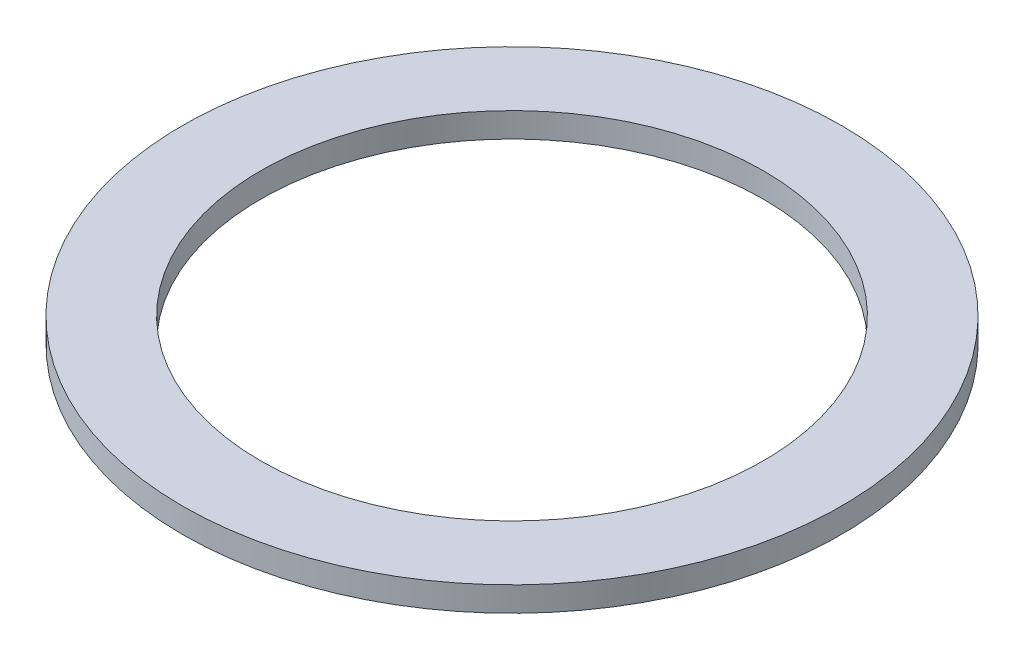
ISO-10303-21;
HEADER;
FILE_DESCRIPTION(('STEP AP214'),'2;1');
FILE_NAME('part.step','',(''),(''),'','','');
FILE_SCHEMA(('AUTOMOTIVE_DESIGN { 1 0 10303 214 1 1 1 1 }'));
ENDSEC;
DATA;
#1=APPLICATION_CONTEXT('core data for automotive mechanical design processes');
#2=APPLICATION_PROTOCOL_DEFINITION('international standard','automotive_design',2000,#1);
#3=PRODUCT_CONTEXT('',#1,'mechanical');
#4=PRODUCT('Part','Part','',(#3));
#5=PRODUCT_RELATED_PRODUCT_CATEGORY('part','',(#4));
#6=PRODUCT_DEFINITION_FORMATION('','',#4);
#7=PRODUCT_DEFINITION_CONTEXT('part definition',#1,'design');
#8=PRODUCT_DEFINITION('design','',#6,#7);
#9=PRODUCT_DEFINITION_SHAPE('','',#8);
#10=(LENGTH_UNIT() NAMED_UNIT(*) SI_UNIT(.MILLI.,.METRE.));
#11=(NAMED_UNIT(*) PLANE_ANGLE_UNIT() SI_UNIT($,.RADIAN.));
#12=(NAMED_UNIT(*) SI_UNIT($,.STERADIAN.) SOLID_ANGLE_UNIT());
#13=UNCERTAINTY_MEASURE_WITH_UNIT(LENGTH_MEASURE(1.E-05),#10,'distance_accuracy_value','');
#14=(GEOMETRIC_REPRESENTATION_CONTEXT(3) GLOBAL_UNCERTAINTY_ASSIGNED_CONTEXT((#13)) GLOBAL_UNIT_ASSIGNED_CONTEXT((#10,
#11,#12)) REPRESENTATION_CONTEXT('',''));
#15=CARTESIAN_POINT('',(0.,0.,0.));
#16=DIRECTION('',(0.,0.,1.));
#17=DIRECTION('',(1.,0.,0.));
#18=AXIS2_PLACEMENT_3D('',#15,#16,#17);
#19=CARTESIAN_POINT('',(0.,0.508000000000008,0.));
#20=DIRECTION('',(0.,1.,0.));
#21=DIRECTION('',(0.,0.,1.00000000000003));
#22=AXIS2_PLACEMENT_3D('',#19,#20,#21);
#23=PLANE('',#22);
#24=CARTESIAN_POINT('',(0.,0.508000000000008,0.));
#25=DIRECTION('',(0.,1.,0.));
#26=DIRECTION('',(0.,0.,1.00000000000003));
#27=AXIS2_PLACEMENT_3D('',#24,#25,#26);
#28=CIRCLE('',#27,6.7945);
#29=CARTESIAN_POINT('',(0.,0.508000000000008,6.79450000000019));
#30=VERTEX_POINT('',#29);
#31=EDGE_CURVE('E10',#30,#30,#28,.T.);
#32=ORIENTED_EDGE('',*,*,#31,.T.);
#33=EDGE_LOOP('',(#32));
#34=FACE_BOUND('',#33,.T.);
#35=CARTESIAN_POINT('',(0.,0.508000000000008,0.));
#36=DIRECTION('',(0.,1.,0.));
#37=DIRECTION('',(0.,0.,1.00000000000003));
#38=AXIS2_PLACEMENT_3D('',#35,#36,#37);
#39=CIRCLE('',#38,5.1816);
#40=CARTESIAN_POINT('',(0.,0.508000000000008,5.18160000000014));
#41=VERTEX_POINT('',#40);
#42=EDGE_CURVE('E44',#41,#41,#39,.T.);
#43=ORIENTED_EDGE('',*,*,#42,.F.);
#44=EDGE_LOOP('',(#43));
#45=FACE_BOUND('',#44,.T.);
#46=ADVANCED_FACE('F33',(#34,#45),#23,.T.);
#47=CARTESIAN_POINT('',(0.,0.,0.));
#48=DIRECTION('',(0.,1.,0.));
#49=DIRECTION('',(0.,0.,1.00000000000003));
#50=AXIS2_PLACEMENT_3D('',#47,#48,#49);
#51=PLANE('',#50);
#52=CARTESIAN_POINT('',(0.,0.,0.));
#53=DIRECTION('',(0.,1.,0.));
#54=DIRECTION('',(0.,0.,1.00000000000003));
#55=AXIS2_PLACEMENT_3D('',#52,#53,#54);
#56=CIRCLE('',#55,6.7945);
#57=CARTESIAN_POINT('',(0.,0.,6.79450000000019));
#58=VERTEX_POINT('',#57);
#59=EDGE_CURVE('E37',#58,#58,#56,.T.);
#60=ORIENTED_EDGE('',*,*,#59,.F.);
#61=EDGE_LOOP('',(#60));
#62=FACE_BOUND('',#61,.T.);
#63=CARTESIAN_POINT('',(0.,0.,0.));
#64=DIRECTION('',(0.,1.,0.));
#65=DIRECTION('',(0.,0.,1.00000000000003));
#66=AXIS2_PLACEMENT_3D('',#63,#64,#65);
#67=CIRCLE('',#66,5.1816);
#68=CARTESIAN_POINT('',(0.,0.,5.18160000000014));
#69=VERTEX_POINT('',#68);
#70=EDGE_CURVE('E46',#69,#69,#67,.T.);
#71=ORIENTED_EDGE('',*,*,#70,.T.);
#72=EDGE_LOOP('',(#71));
#73=FACE_BOUND('',#72,.T.);
#74=ADVANCED_FACE('F56',(#62,#73),#51,.F.);
#75=CARTESIAN_POINT('',(0.,0.508000000000008,0.));
#76=DIRECTION('',(0.,-1.,0.));
#77=DIRECTION('',(0.,0.,-1.00000000000003));
#78=AXIS2_PLACEMENT_3D('',#75,#76,#77);
#79=CYLINDRICAL_SURFACE('',#78,6.7945);
#80=ORIENTED_EDGE('',*,*,#31,.F.);
#81=EDGE_LOOP('',(#80));
#82=FACE_BOUND('',#81,.T.);
#83=ORIENTED_EDGE('',*,*,#59,.T.);
#84=EDGE_LOOP('',(#83));
#85=FACE_BOUND('',#84,.T.);
#86=ADVANCED_FACE('F35',(#82,#85),#79,.T.);
#87=CARTESIAN_POINT('',(0.,0.508000000000008,0.));
#88=DIRECTION('',(0.,-1.,0.));
#89=DIRECTION('',(0.,0.,-1.00000000000003));
#90=AXIS2_PLACEMENT_3D('',#87,#88,#89);
#91=CYLINDRICAL_SURFACE('',#90,5.1816);
#92=ORIENTED_EDGE('',*,*,#42,.T.);
#93=EDGE_LOOP('',(#92));
#94=FACE_BOUND('',#93,.T.);
#95=ORIENTED_EDGE('',*,*,#70,.F.);
#96=EDGE_LOOP('',(#95));
#97=FACE_BOUND('',#96,.T.);
#98=ADVANCED_FACE('F52',(#94,#97),#91,.F.);
#99=CLOSED_SHELL('',(#46,#74,#86,#98));
#100=MANIFOLD_SOLID_BREP('B2',#99);
#101=ADVANCED_BREP_SHAPE_REPRESENTATION('',(#18,#100),#14);
#102=SHAPE_DEFINITION_REPRESENTATION(#9,#101);
ENDSEC;
END-ISO-10303-21;
